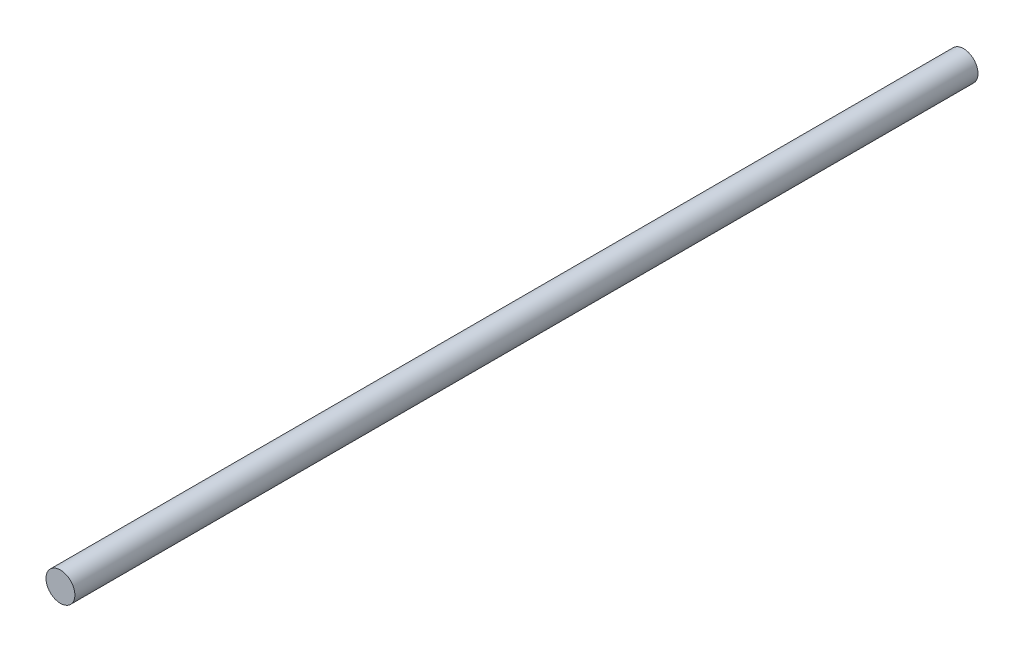
ISO-10303-21;
HEADER;
FILE_DESCRIPTION(('STEP AP214'),'2;1');
FILE_NAME('part.step','',(''),(''),'','','');
FILE_SCHEMA(('AUTOMOTIVE_DESIGN { 1 0 10303 214 1 1 1 1 }'));
ENDSEC;
DATA;
#1=APPLICATION_CONTEXT('core data for automotive mechanical design processes');
#2=APPLICATION_PROTOCOL_DEFINITION('international standard','automotive_design',2000,#1);
#3=PRODUCT_CONTEXT('',#1,'mechanical');
#4=PRODUCT('Part','Part','',(#3));
#5=PRODUCT_RELATED_PRODUCT_CATEGORY('part','',(#4));
#6=PRODUCT_DEFINITION_FORMATION('','',#4);
#7=PRODUCT_DEFINITION_CONTEXT('part definition',#1,'design');
#8=PRODUCT_DEFINITION('design','',#6,#7);
#9=PRODUCT_DEFINITION_SHAPE('','',#8);
#10=(LENGTH_UNIT() NAMED_UNIT(*) SI_UNIT(.MILLI.,.METRE.));
#11=(NAMED_UNIT(*) PLANE_ANGLE_UNIT() SI_UNIT($,.RADIAN.));
#12=(NAMED_UNIT(*) SI_UNIT($,.STERADIAN.) SOLID_ANGLE_UNIT());
#13=UNCERTAINTY_MEASURE_WITH_UNIT(LENGTH_MEASURE(1.E-05),#10,'distance_accuracy_value','');
#14=(GEOMETRIC_REPRESENTATION_CONTEXT(3) GLOBAL_UNCERTAINTY_ASSIGNED_CONTEXT((#13)) GLOBAL_UNIT_ASSIGNED_CONTEXT((#10,
#11,#12)) REPRESENTATION_CONTEXT('',''));
#15=CARTESIAN_POINT('',(0.,0.,0.));
#16=DIRECTION('',(0.,0.,1.));
#17=DIRECTION('',(1.,0.,0.));
#18=AXIS2_PLACEMENT_3D('',#15,#16,#17);
#19=CARTESIAN_POINT('',(0.,0.,250.));
#20=DIRECTION('',(0.,0.,-1.));
#21=DIRECTION('',(-1.,0.,0.));
#22=AXIS2_PLACEMENT_3D('',#19,#20,#21);
#23=CYLINDRICAL_SURFACE('',#22,4.);
#24=CARTESIAN_POINT('',(0.,0.,250.));
#25=DIRECTION('',(0.,0.,1.));
#26=DIRECTION('',(1.,0.,0.));
#27=AXIS2_PLACEMENT_3D('',#24,#25,#26);
#28=CIRCLE('',#27,4.);
#29=CARTESIAN_POINT('',(4.,0.,250.));
#30=VERTEX_POINT('',#29);
#31=EDGE_CURVE('E10',#30,#30,#28,.T.);
#32=ORIENTED_EDGE('',*,*,#31,.F.);
#33=EDGE_LOOP('',(#32));
#34=FACE_BOUND('',#33,.T.);
#35=CARTESIAN_POINT('',(0.,0.,0.));
#36=DIRECTION('',(0.,0.,1.));
#37=DIRECTION('',(1.,0.,0.));
#38=AXIS2_PLACEMENT_3D('',#35,#36,#37);
#39=CIRCLE('',#38,4.);
#40=CARTESIAN_POINT('',(4.,0.,0.));
#41=VERTEX_POINT('',#40);
#42=EDGE_CURVE('E35',#41,#41,#39,.T.);
#43=ORIENTED_EDGE('',*,*,#42,.T.);
#44=EDGE_LOOP('',(#43));
#45=FACE_BOUND('',#44,.T.);
#46=ADVANCED_FACE('F32',(#34,#45),#23,.T.);
#47=CARTESIAN_POINT('',(0.,0.,250.));
#48=DIRECTION('',(0.,0.,1.));
#49=DIRECTION('',(1.,0.,0.));
#50=AXIS2_PLACEMENT_3D('',#47,#48,#49);
#51=PLANE('',#50);
#52=ORIENTED_EDGE('',*,*,#31,.T.);
#53=EDGE_LOOP('',(#52));
#54=FACE_BOUND('',#53,.T.);
#55=ADVANCED_FACE('F47',(#54),#51,.T.);
#56=CARTESIAN_POINT('',(0.,0.,0.));
#57=DIRECTION('',(0.,0.,1.));
#58=DIRECTION('',(1.,0.,0.));
#59=AXIS2_PLACEMENT_3D('',#56,#57,#58);
#60=PLANE('',#59);
#61=ORIENTED_EDGE('',*,*,#42,.F.);
#62=EDGE_LOOP('',(#61));
#63=FACE_BOUND('',#62,.T.);
#64=ADVANCED_FACE('F45',(#63),#60,.F.);
#65=CLOSED_SHELL('',(#46,#55,#64));
#66=MANIFOLD_SOLID_BREP('B2',#65);
#67=ADVANCED_BREP_SHAPE_REPRESENTATION('',(#18,#66),#14);
#68=SHAPE_DEFINITION_REPRESENTATION(#9,#67);
ENDSEC;
END-ISO-10303-21;
